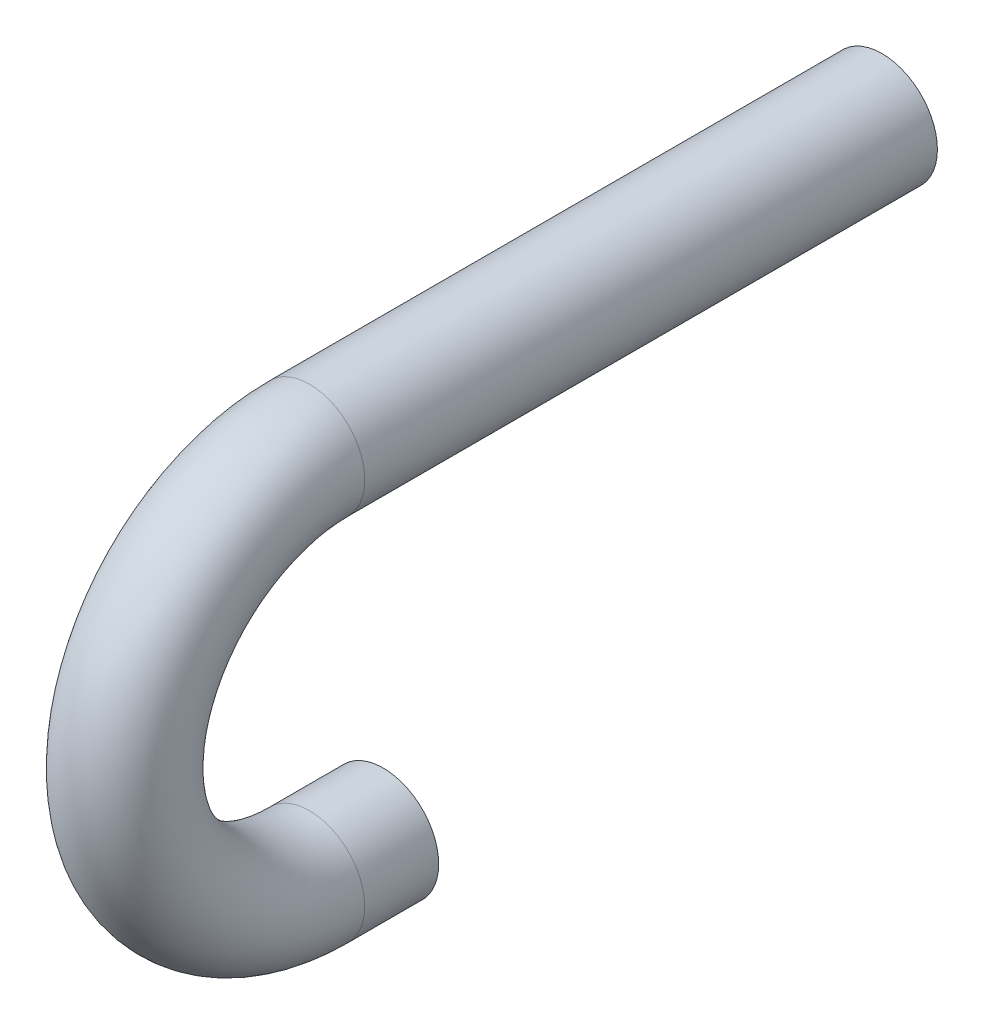
ISO-10303-21;
HEADER;
FILE_DESCRIPTION(('STEP AP214'),'2;1');
FILE_NAME('part.step','',(''),(''),'','','');
FILE_SCHEMA(('AUTOMOTIVE_DESIGN { 1 0 10303 214 1 1 1 1 }'));
ENDSEC;
DATA;
#1=APPLICATION_CONTEXT('core data for automotive mechanical design processes');
#2=APPLICATION_PROTOCOL_DEFINITION('international standard','automotive_design',2000,#1);
#3=PRODUCT_CONTEXT('',#1,'mechanical');
#4=PRODUCT('Part','Part','',(#3));
#5=PRODUCT_RELATED_PRODUCT_CATEGORY('part','',(#4));
#6=PRODUCT_DEFINITION_FORMATION('','',#4);
#7=PRODUCT_DEFINITION_CONTEXT('part definition',#1,'design');
#8=PRODUCT_DEFINITION('design','',#6,#7);
#9=PRODUCT_DEFINITION_SHAPE('','',#8);
#10=(LENGTH_UNIT() NAMED_UNIT(*) SI_UNIT(.MILLI.,.METRE.));
#11=(NAMED_UNIT(*) PLANE_ANGLE_UNIT() SI_UNIT($,.RADIAN.));
#12=(NAMED_UNIT(*) SI_UNIT($,.STERADIAN.) SOLID_ANGLE_UNIT());
#13=UNCERTAINTY_MEASURE_WITH_UNIT(LENGTH_MEASURE(1.E-05),#10,'distance_accuracy_value','');
#14=(GEOMETRIC_REPRESENTATION_CONTEXT(3) GLOBAL_UNCERTAINTY_ASSIGNED_CONTEXT((#13)) GLOBAL_UNIT_ASSIGNED_CONTEXT((#10,
#11,#12)) REPRESENTATION_CONTEXT('',''));
#15=CARTESIAN_POINT('',(0.,0.,0.));
#16=DIRECTION('',(0.,0.,1.));
#17=DIRECTION('',(1.,0.,0.));
#18=AXIS2_PLACEMENT_3D('',#15,#16,#17);
#19=CARTESIAN_POINT('',(181.,64.8959813156576,58.8606367334853));
#20=DIRECTION('',(0.,0.,-1.));
#21=DIRECTION('',(-1.,0.,0.));
#22=AXIS2_PLACEMENT_3D('',#19,#20,#21);
#23=CYLINDRICAL_SURFACE('',#22,1.5);
#24=CARTESIAN_POINT('',(181.,64.8959813156576,57.8606367334853));
#25=DIRECTION('',(0.,0.,1.));
#26=DIRECTION('',(1.,0.,0.));
#27=AXIS2_PLACEMENT_3D('',#24,#25,#26);
#28=CIRCLE('',#27,1.5);
#29=CARTESIAN_POINT('',(182.5,64.8959813156576,57.8606367334853));
#30=VERTEX_POINT('',#29);
#31=EDGE_CURVE('E10',#30,#30,#28,.T.);
#32=ORIENTED_EDGE('',*,*,#31,.T.);
#33=EDGE_LOOP('',(#32));
#34=FACE_BOUND('',#33,.T.);
#35=CARTESIAN_POINT('',(181.,64.8959813156576,73.3623356852172));
#36=DIRECTION('',(0.,0.,1.));
#37=DIRECTION('',(1.,0.,0.));
#38=AXIS2_PLACEMENT_3D('',#35,#36,#37);
#39=CIRCLE('',#38,1.5);
#40=CARTESIAN_POINT('',(181.,66.3959813156576,73.3623356852172));
#41=VERTEX_POINT('',#40);
#42=EDGE_CURVE('E52',#41,#41,#39,.T.);
#43=ORIENTED_EDGE('',*,*,#42,.F.);
#44=EDGE_LOOP('',(#43));
#45=FACE_BOUND('',#44,.T.);
#46=ADVANCED_FACE('F38',(#34,#45),#23,.T.);
#47=CARTESIAN_POINT('',(181.,64.8959813156576,57.8606367334853));
#48=DIRECTION('',(0.,0.,1.));
#49=DIRECTION('',(1.,0.,0.));
#50=AXIS2_PLACEMENT_3D('',#47,#48,#49);
#51=PLANE('',#50);
#52=ORIENTED_EDGE('',*,*,#31,.F.);
#53=EDGE_LOOP('',(#52));
#54=FACE_BOUND('',#53,.T.);
#55=ADVANCED_FACE('F61',(#54),#51,.F.);
#56=CARTESIAN_POINT('',(181.,54.8959813156576,71.3623356852172));
#57=DIRECTION('',(0.,0.,-1.));
#58=DIRECTION('',(1.,0.,0.));
#59=AXIS2_PLACEMENT_3D('',#56,#57,#58);
#60=PLANE('',#59);
#61=CARTESIAN_POINT('',(181.,54.8959813156576,71.3623356852172));
#62=DIRECTION('',(0.,0.,-1.));
#63=DIRECTION('',(1.,0.,0.));
#64=AXIS2_PLACEMENT_3D('',#61,#62,#63);
#65=CIRCLE('',#64,1.5);
#66=CARTESIAN_POINT('',(182.5,54.8959813156576,71.3623356852172));
#67=VERTEX_POINT('',#66);
#68=EDGE_CURVE('E44',#67,#67,#65,.T.);
#69=ORIENTED_EDGE('',*,*,#68,.T.);
#70=EDGE_LOOP('',(#69));
#71=FACE_BOUND('',#70,.T.);
#72=ADVANCED_FACE('F65',(#71),#60,.T.);
#73=CARTESIAN_POINT('',(181.,59.8959813156576,73.3623356852172));
#74=DIRECTION('',(1.,0.,0.));
#75=DIRECTION('',(0.,0.,-1.));
#76=AXIS2_PLACEMENT_3D('',#73,#74,#75);
#77=TOROIDAL_SURFACE('',#76,5.,1.5);
#78=CARTESIAN_POINT('',(181.,54.8959813156576,73.3623356852172));
#79=DIRECTION('',(0.,0.,-1.));
#80=DIRECTION('',(1.,0.,0.));
#81=AXIS2_PLACEMENT_3D('',#78,#79,#80);
#82=CIRCLE('',#81,1.5);
#83=CARTESIAN_POINT('',(181.,53.3959813156576,73.3623356852172));
#84=VERTEX_POINT('',#83);
#85=EDGE_CURVE('E48',#84,#84,#82,.T.);
#86=CARTESIAN_POINT('',(181.,59.8959813156576,73.3623356852172));
#87=DIRECTION('',(1.,0.,0.));
#88=DIRECTION('',(0.,0.,-1.));
#89=AXIS2_PLACEMENT_3D('',#86,#87,#88);
#90=CIRCLE('',#89,6.5);
#91=EDGE_CURVE('',#41,#84,#90,.T.);
#92=ORIENTED_EDGE('',*,*,#42,.T.);
#93=ORIENTED_EDGE('',*,*,#85,.F.);
#94=ORIENTED_EDGE('',*,*,#91,.T.);
#95=ORIENTED_EDGE('',*,*,#91,.F.);
#96=EDGE_LOOP('',(#92,#94,#93,#95));
#97=FACE_BOUND('',#96,.T.);
#98=ADVANCED_FACE('F58',(#97),#77,.T.);
#99=CARTESIAN_POINT('',(181.,54.8959813156576,73.3623356852172));
#100=DIRECTION('',(0.,0.,-1.));
#101=DIRECTION('',(-1.,0.,0.));
#102=AXIS2_PLACEMENT_3D('',#99,#100,#101);
#103=CYLINDRICAL_SURFACE('',#102,1.5);
#104=ORIENTED_EDGE('',*,*,#68,.F.);
#105=EDGE_LOOP('',(#104));
#106=FACE_BOUND('',#105,.T.);
#107=ORIENTED_EDGE('',*,*,#85,.T.);
#108=EDGE_LOOP('',(#107));
#109=FACE_BOUND('',#108,.T.);
#110=ADVANCED_FACE('F67',(#106,#109),#103,.T.);
#111=CLOSED_SHELL('',(#46,#55,#72,#98,#110));
#112=MANIFOLD_SOLID_BREP('B2',#111);
#113=ADVANCED_BREP_SHAPE_REPRESENTATION('',(#18,#112),#14);
#114=SHAPE_DEFINITION_REPRESENTATION(#9,#113);
ENDSEC;
END-ISO-10303-21;
